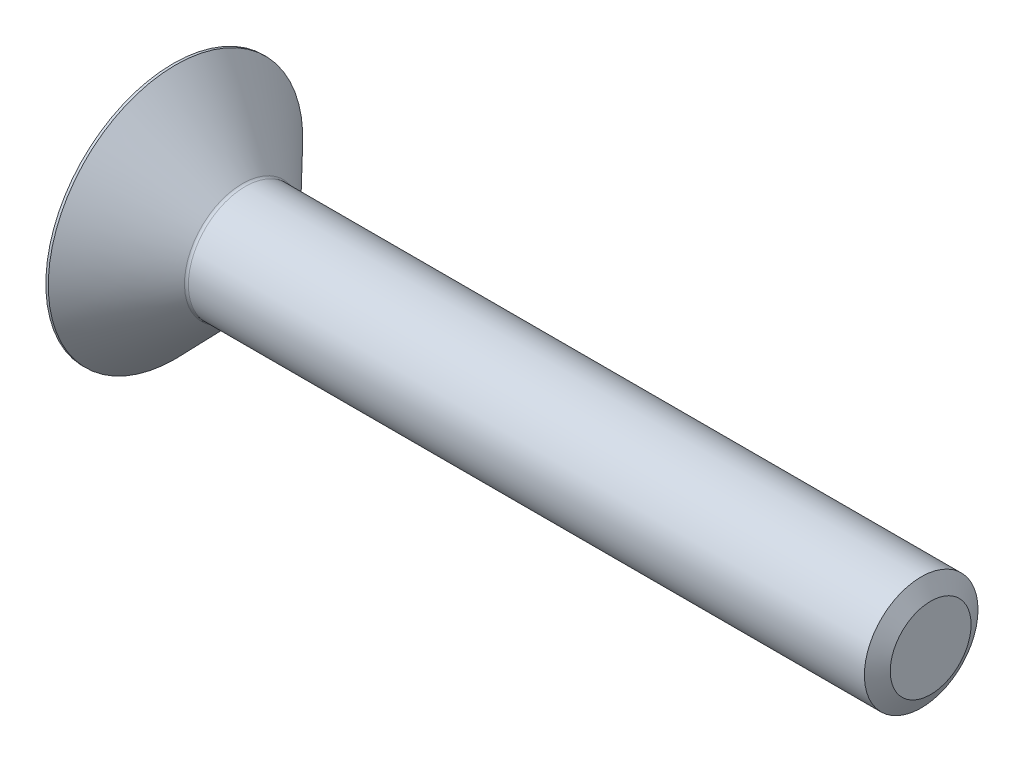
ISO-10303-21;
HEADER;
FILE_DESCRIPTION(('STEP AP214'),'2;1');
FILE_NAME('part.step','',(''),(''),'','','');
FILE_SCHEMA(('AUTOMOTIVE_DESIGN { 1 0 10303 214 1 1 1 1 }'));
ENDSEC;
DATA;
#1=APPLICATION_CONTEXT('core data for automotive mechanical design processes');
#2=APPLICATION_PROTOCOL_DEFINITION('international standard','automotive_design',2000,#1);
#3=PRODUCT_CONTEXT('',#1,'mechanical');
#4=PRODUCT('Part','Part','',(#3));
#5=PRODUCT_RELATED_PRODUCT_CATEGORY('part','',(#4));
#6=PRODUCT_DEFINITION_FORMATION('','',#4);
#7=PRODUCT_DEFINITION_CONTEXT('part definition',#1,'design');
#8=PRODUCT_DEFINITION('design','',#6,#7);
#9=PRODUCT_DEFINITION_SHAPE('','',#8);
#10=(LENGTH_UNIT() NAMED_UNIT(*) SI_UNIT(.MILLI.,.METRE.));
#11=(NAMED_UNIT(*) PLANE_ANGLE_UNIT() SI_UNIT($,.RADIAN.));
#12=(NAMED_UNIT(*) SI_UNIT($,.STERADIAN.) SOLID_ANGLE_UNIT());
#13=UNCERTAINTY_MEASURE_WITH_UNIT(LENGTH_MEASURE(1.E-05),#10,'distance_accuracy_value','');
#14=(GEOMETRIC_REPRESENTATION_CONTEXT(3) GLOBAL_UNCERTAINTY_ASSIGNED_CONTEXT((#13)) GLOBAL_UNIT_ASSIGNED_CONTEXT((#10,
#11,#12)) REPRESENTATION_CONTEXT('',''));
#15=CARTESIAN_POINT('',(0.,0.,0.));
#16=DIRECTION('',(0.,0.,1.));
#17=DIRECTION('',(1.,0.,0.));
#18=AXIS2_PLACEMENT_3D('',#15,#16,#17);
#19=CARTESIAN_POINT('',(0.,0.,0.));
#20=DIRECTION('',(1.,0.,0.));
#21=DIRECTION('',(0.,1.,0.));
#22=AXIS2_PLACEMENT_3D('',#19,#20,#21);
#23=CYLINDRICAL_SURFACE('',#22,1.5);
#24=CARTESIAN_POINT('',(-18.097552518379,0.,0.));
#25=DIRECTION('',(-1.,0.,0.));
#26=DIRECTION('',(0.,1.,0.));
#27=AXIS2_PLACEMENT_3D('',#24,#25,#26);
#28=CIRCLE('',#27,1.5);
#29=CARTESIAN_POINT('',(-18.097552518379,1.5,0.));
#30=VERTEX_POINT('',#29);
#31=EDGE_CURVE('E117',#30,#30,#28,.T.);
#32=ORIENTED_EDGE('',*,*,#31,.F.);
#33=EDGE_LOOP('',(#32));
#34=FACE_BOUND('',#33,.T.);
#35=CARTESIAN_POINT('',(-0.25,0.,0.));
#36=DIRECTION('',(1.,0.,0.));
#37=DIRECTION('',(0.,0.,-1.));
#38=AXIS2_PLACEMENT_3D('',#35,#36,#37);
#39=CIRCLE('',#38,1.5);
#40=CARTESIAN_POINT('',(-0.25,0.,-1.5));
#41=VERTEX_POINT('',#40);
#42=EDGE_CURVE('E279',#41,#41,#39,.T.);
#43=ORIENTED_EDGE('',*,*,#42,.F.);
#44=EDGE_LOOP('',(#43));
#45=FACE_BOUND('',#44,.T.);
#46=ADVANCED_FACE('F47',(#34,#45),#23,.T.);
#47=CARTESIAN_POINT('',(-20.,3.36,0.));
#48=DIRECTION('',(-1.,0.,0.));
#49=DIRECTION('',(0.,-1.,0.));
#50=AXIS2_PLACEMENT_3D('',#47,#48,#49);
#51=PLANE('',#50);
#52=CARTESIAN_POINT('',(-20.,0.,0.));
#53=DIRECTION('',(-1.,0.,0.));
#54=DIRECTION('',(0.,1.,0.));
#55=AXIS2_PLACEMENT_3D('',#52,#53,#54);
#56=CIRCLE('',#55,3.36);
#57=CARTESIAN_POINT('',(-20.,3.36,0.));
#58=VERTEX_POINT('',#57);
#59=EDGE_CURVE('E151',#58,#58,#56,.T.);
#60=ORIENTED_EDGE('',*,*,#59,.T.);
#61=EDGE_LOOP('',(#60));
#62=FACE_BOUND('',#61,.T.);
#63=CARTESIAN_POINT('',(-20.,0.,0.));
#64=DIRECTION('',(1.,0.,0.));
#65=DIRECTION('',(0.,-1.,0.));
#66=AXIS2_PLACEMENT_3D('',#63,#64,#65);
#67=CIRCLE('',#66,1.15470053837925);
#68=CARTESIAN_POINT('',(-20.,-0.577350269189632,-0.999999999999995));
#69=VERTEX_POINT('',#68);
#70=CARTESIAN_POINT('',(-20.,-1.15470053837925,0.));
#71=VERTEX_POINT('',#70);
#72=EDGE_CURVE('E51',#69,#71,#67,.F.);
#73=ORIENTED_EDGE('',*,*,#72,.F.);
#74=CARTESIAN_POINT('',(-20.,0.577350269189629,-0.999999999999997));
#75=VERTEX_POINT('',#74);
#76=EDGE_CURVE('E133',#75,#69,#67,.F.);
#77=ORIENTED_EDGE('',*,*,#76,.F.);
#78=CARTESIAN_POINT('',(-20.,0.,0.));
#79=DIRECTION('',(1.,0.,0.));
#80=DIRECTION('',(0.,0.,-1.));
#81=AXIS2_PLACEMENT_3D('',#78,#79,#80);
#82=CIRCLE('',#81,1.15470053837925);
#83=CARTESIAN_POINT('',(-20.,1.15470053837925,0.));
#84=VERTEX_POINT('',#83);
#85=EDGE_CURVE('E138',#75,#84,#82,.T.);
#86=ORIENTED_EDGE('',*,*,#85,.T.);
#87=CARTESIAN_POINT('',(-20.,0.577350269189625,0.999999999999999));
#88=VERTEX_POINT('',#87);
#89=EDGE_CURVE('E148',#88,#84,#67,.F.);
#90=ORIENTED_EDGE('',*,*,#89,.F.);
#91=CARTESIAN_POINT('',(-20.,-0.577350269189632,0.999999999999996));
#92=VERTEX_POINT('',#91);
#93=EDGE_CURVE('E56',#92,#88,#67,.F.);
#94=ORIENTED_EDGE('',*,*,#93,.F.);
#95=EDGE_CURVE('E11',#71,#92,#67,.F.);
#96=ORIENTED_EDGE('',*,*,#95,.F.);
#97=EDGE_LOOP('',(#73,#77,#86,#90,#94,#96));
#98=FACE_BOUND('',#97,.T.);
#99=ADVANCED_FACE('F145',(#62,#98),#51,.T.);
#100=CARTESIAN_POINT('',(0.,0.,0.));
#101=DIRECTION('',(1.,0.,0.));
#102=DIRECTION('',(0.,1.,0.));
#103=AXIS2_PLACEMENT_3D('',#100,#101,#102);
#104=CYLINDRICAL_SURFACE('',#103,3.36);
#105=ORIENTED_EDGE('',*,*,#59,.F.);
#106=EDGE_LOOP('',(#105));
#107=FACE_BOUND('',#106,.T.);
#108=CARTESIAN_POINT('',(-19.9361811211411,0.,0.));
#109=DIRECTION('',(-1.,0.,0.));
#110=DIRECTION('',(0.,1.,0.));
#111=AXIS2_PLACEMENT_3D('',#108,#109,#110);
#112=CIRCLE('',#111,3.36);
#113=CARTESIAN_POINT('',(-19.9361811211411,3.36,0.));
#114=VERTEX_POINT('',#113);
#115=EDGE_CURVE('E155',#114,#114,#112,.T.);
#116=ORIENTED_EDGE('',*,*,#115,.T.);
#117=EDGE_LOOP('',(#116));
#118=FACE_BOUND('',#117,.T.);
#119=ADVANCED_FACE('F260',(#107,#118),#104,.T.);
#120=CARTESIAN_POINT('',(-18.1694864984129,0.,0.));
#121=DIRECTION('',(-1.,0.,0.));
#122=DIRECTION('',(0.,-1.,0.));
#123=AXIS2_PLACEMENT_3D('',#120,#121,#122);
#124=CONICAL_SURFACE('',#123,1.5305341629541,0.802851455917392);
#125=ORIENTED_EDGE('',*,*,#115,.F.);
#126=EDGE_LOOP('',(#125));
#127=FACE_BOUND('',#126,.T.);
#128=CARTESIAN_POINT('',(-18.1694864984129,0.,0.));
#129=DIRECTION('',(-1.,0.,0.));
#130=DIRECTION('',(0.,1.,0.));
#131=AXIS2_PLACEMENT_3D('',#128,#129,#130);
#132=CIRCLE('',#131,1.5305341629541);
#133=CARTESIAN_POINT('',(-18.1694864984129,1.5305341629541,0.));
#134=VERTEX_POINT('',#133);
#135=EDGE_CURVE('E254',#134,#134,#132,.T.);
#136=ORIENTED_EDGE('',*,*,#135,.T.);
#137=EDGE_LOOP('',(#136));
#138=FACE_BOUND('',#137,.T.);
#139=ADVANCED_FACE('F262',(#127,#138),#124,.T.);
#140=CARTESIAN_POINT('',(-18.097552518379,0.,0.));
#141=DIRECTION('',(1.,0.,0.));
#142=DIRECTION('',(0.,1.,0.));
#143=AXIS2_PLACEMENT_3D('',#140,#141,#142);
#144=TOROIDAL_SURFACE('',#143,1.6,0.099999999999999);
#145=ORIENTED_EDGE('',*,*,#135,.F.);
#146=EDGE_LOOP('',(#145));
#147=FACE_BOUND('',#146,.T.);
#148=ORIENTED_EDGE('',*,*,#31,.T.);
#149=EDGE_LOOP('',(#148));
#150=FACE_BOUND('',#149,.T.);
#151=ADVANCED_FACE('F265',(#147,#150),#144,.F.);
#152=CARTESIAN_POINT('',(-19.7,0.,0.));
#153=DIRECTION('',(-1.,0.,0.));
#154=DIRECTION('',(0.,0.,-1.));
#155=AXIS2_PLACEMENT_3D('',#152,#153,#154);
#156=CONICAL_SURFACE('',#155,0.,1.31660847419538);
#157=CARTESIAN_POINT('',(-20.0000300044996,-0.57723479913579,-1.0002));
#158=CARTESIAN_POINT('',(-19.9937929192042,-0.601225021738601,-0.958647715567044));
#159=CARTESIAN_POINT('',(-19.9881313786167,-0.625256195021442,-0.917024502475671));
#160=CARTESIAN_POINT('',(-19.9781854217223,-0.673398386330441,-0.833639781140785));
#161=CARTESIAN_POINT('',(-19.9739015302713,-0.697509431260086,-0.791878226299064));
#162=CARTESIAN_POINT('',(-19.9669589031667,-0.745673772514857,-0.708455140132714));
#163=CARTESIAN_POINT('',(-19.9642923745456,-0.769726780462719,-0.66679410829216));
#164=CARTESIAN_POINT('',(-19.9607168929941,-0.817861664223351,-0.583422044002323));
#165=CARTESIAN_POINT('',(-19.9598076211353,-0.841943534003896,-0.541711022001162));
#166=CARTESIAN_POINT('',(-19.9598076211353,-0.890107273564986,-0.458288977998839));
#167=CARTESIAN_POINT('',(-19.9607168929941,-0.91418914334553,-0.416577955997678));
#168=CARTESIAN_POINT('',(-19.9642923745456,-0.962324027106162,-0.333205891707841));
#169=CARTESIAN_POINT('',(-19.9669589031667,-0.986377035054024,-0.291544859867286));
#170=CARTESIAN_POINT('',(-19.9739015302713,-1.0345413763088,-0.208121773700937));
#171=CARTESIAN_POINT('',(-19.9781854217223,-1.05865242123844,-0.166360218859216));
#172=CARTESIAN_POINT('',(-19.9881313786167,-1.10679461254744,-0.0829754975243293));
#173=CARTESIAN_POINT('',(-19.9937929192042,-1.13082578583028,-0.0413522844329566));
#174=CARTESIAN_POINT('',(-20.0000300044996,-1.15481600843309,0.000199999999999027));
#175=B_SPLINE_CURVE_WITH_KNOTS('',3,(#157,#158,#159,#160,#161,#162,#163,#164,#165,#166,#167,
#168,#169,#170,#171,#172,#173,#174),.UNSPECIFIED.,.F.,.F.,(4,2,2,2,2,2,2,2,4),(0.,
0.145159524820137,0.290374287087484,0.434883682122849,0.57936684736763,0.723850012612411,
0.868359407647776,1.01357416991512,1.15873369473526),.UNSPECIFIED.);
#176=EDGE_CURVE('E135',#69,#71,#175,.T.);
#177=ORIENTED_EDGE('',*,*,#176,.F.);
#178=ORIENTED_EDGE('',*,*,#72,.T.);
#179=EDGE_LOOP('',(#177,#178));
#180=FACE_BOUND('',#179,.T.);
#181=ADVANCED_FACE('F271',(#180),#156,.F.);
#182=CARTESIAN_POINT('',(-20.1701338061757,-1.50813004503231,-1.));
#183=CARTESIAN_POINT('',(-20.1603550434582,-1.4629616955144,-1.));
#184=CARTESIAN_POINT('',(-20.1507010634319,-1.41776633015548,-1.));
#185=CARTESIAN_POINT('',(-20.1317057249496,-1.32730802004726,-1.));
#186=CARTESIAN_POINT('',(-20.1223643798043,-1.28204507250605,-1.));
#187=CARTESIAN_POINT('',(-20.094887707109,-1.14605409321351,-1.));
#188=CARTESIAN_POINT('',(-20.077318593487,-1.05520983554784,-1.));
#189=CARTESIAN_POINT('',(-20.0446113120355,-0.873838301527075,-1.));
#190=CARTESIAN_POINT('',(-20.0294545669183,-0.783314439111175,-1.));
#191=CARTESIAN_POINT('',(-20.0026000869216,-0.601754544937862,-1.));
#192=CARTESIAN_POINT('',(-19.9909016960468,-0.510718613654574,-1.));
#193=CARTESIAN_POINT('',(-19.9724688104588,-0.327147289363391,-1.));
#194=CARTESIAN_POINT('',(-19.965787761882,-0.234606191530869,-1.));
#195=CARTESIAN_POINT('',(-19.9590368362792,-0.049304654603892,-1.));
#196=CARTESIAN_POINT('',(-19.9589640024594,0.0434556678202334,-1.));
#197=CARTESIAN_POINT('',(-19.9654534933963,0.229083736297408,-1.));
#198=CARTESIAN_POINT('',(-19.9720414736928,0.321950510989412,-1.));
#199=CARTESIAN_POINT('',(-19.9904572139866,0.507192547661323,-1.));
#200=CARTESIAN_POINT('',(-20.0022884816114,0.599567438647768,-1.));
#201=CARTESIAN_POINT('',(-20.0298118313046,0.785811374344477,-1.));
#202=CARTESIAN_POINT('',(-20.0455836030667,0.879668210998828,-1.));
#203=CARTESIAN_POINT('',(-20.0795232966728,1.06695285350417,-1.));
#204=CARTESIAN_POINT('',(-20.0976915787193,1.16038059267178,-1.));
#205=CARTESIAN_POINT('',(-20.1355853163011,1.34694314919726,-1.));
#206=CARTESIAN_POINT('',(-20.1553112029702,1.44007787798179,-1.));
#207=CARTESIAN_POINT('',(-20.1957971322914,1.62612272763755,-1.));
#208=CARTESIAN_POINT('',(-20.216557196056,1.71903284388273,-1.));
#209=CARTESIAN_POINT('',(-20.2585485742601,1.90363742744432,-1.));
#210=CARTESIAN_POINT('',(-20.2797718689088,1.99533372655925,-1.));
#211=CARTESIAN_POINT('',(-20.3227143057913,2.17861191601367,-1.));
#212=CARTESIAN_POINT('',(-20.3444334585808,2.27019380387373,-1.));
#213=CARTESIAN_POINT('',(-20.3882042420233,2.45314970796374,-1.));
#214=CARTESIAN_POINT('',(-20.4102553943374,2.54452383886909,-1.));
#215=CARTESIAN_POINT('',(-20.4546332471854,2.72720190599484,-1.));
#216=CARTESIAN_POINT('',(-20.4769599382911,2.81850584450411,-1.));
#217=CARTESIAN_POINT('',(-20.4993826695211,2.90978592143881,-1.));
#218=B_SPLINE_CURVE_WITH_KNOTS('',3,(#182,#183,#184,#185,#186,#187,#188,#189,#190,#191,#192,
#193,#194,#195,#196,#197,#198,#199,#200,#201,#202,#203,#204,#205,#206,#207,#208,#209,#210,#211,
#212,#213,#214,#215,#216,#217),.UNSPECIFIED.,.F.,.F.,(4,2,2,2,2,2,2,2,2,2,2,2,2,2,2,2,2,4),(0.,
0.138643869889784,0.277293635233155,0.554857004517547,0.830167022781712,1.10542478551795,
1.38357462934899,1.66160001660697,1.94070037269333,2.21998772241581,2.50545939030147,
2.79097401441241,3.07656794584653,3.36216771000263,3.64452690710854,3.92689212062336,
4.2088834354874,4.49086512790399),.UNSPECIFIED.);
#219=EDGE_CURVE('E110',#75,#69,#218,.F.);
#220=ORIENTED_EDGE('',*,*,#219,.F.);
#221=ORIENTED_EDGE('',*,*,#76,.T.);
#222=EDGE_LOOP('',(#220,#221));
#223=FACE_BOUND('',#222,.T.);
#224=ADVANCED_FACE('F131',(#223),#156,.F.);
#225=CARTESIAN_POINT('',(-20.0000300044996,1.15481600843309,0.000199999999999895));
#226=CARTESIAN_POINT('',(-19.9937929192042,1.13082578583028,-0.0413522844329562));
#227=CARTESIAN_POINT('',(-19.9881313786167,1.10679461254744,-0.082975497524329));
#228=CARTESIAN_POINT('',(-19.9781854217223,1.05865242123844,-0.166360218859216));
#229=CARTESIAN_POINT('',(-19.9739015302713,1.03454137630879,-0.208121773700936));
#230=CARTESIAN_POINT('',(-19.9669589031667,0.986377035054022,-0.291544859867286));
#231=CARTESIAN_POINT('',(-19.9642923745456,0.96232402710616,-0.33320589170784));
#232=CARTESIAN_POINT('',(-19.9607168929941,0.914189143345528,-0.416577955997677));
#233=CARTESIAN_POINT('',(-19.9598076211353,0.890107273564983,-0.458288977998838));
#234=CARTESIAN_POINT('',(-19.9598076211353,0.841943534003893,-0.541711022001161));
#235=CARTESIAN_POINT('',(-19.9607168929941,0.817861664223348,-0.583422044002323));
#236=CARTESIAN_POINT('',(-19.9642923745456,0.769726780462716,-0.666794108292159));
#237=CARTESIAN_POINT('',(-19.9669589031667,0.745673772514854,-0.708455140132714));
#238=CARTESIAN_POINT('',(-19.9739015302713,0.697509431260083,-0.791878226299064));
#239=CARTESIAN_POINT('',(-19.9781854217223,0.673398386330438,-0.833639781140784));
#240=CARTESIAN_POINT('',(-19.9881313786167,0.62525619502144,-0.917024502475671));
#241=CARTESIAN_POINT('',(-19.9937929192042,0.601225021738599,-0.958647715567044));
#242=CARTESIAN_POINT('',(-20.0000300044996,0.577234799135788,-1.0002));
#243=B_SPLINE_CURVE_WITH_KNOTS('',3,(#225,#226,#227,#228,#229,#230,#231,#232,#233,#234,#235,
#236,#237,#238,#239,#240,#241,#242),.UNSPECIFIED.,.F.,.F.,(4,2,2,2,2,2,2,2,4),(0.,
0.145159524820138,0.290374287087485,0.43488368212285,0.579366847367631,0.723850012612412,
0.868359407647777,1.01357416991512,1.15873369473526),.UNSPECIFIED.);
#244=EDGE_CURVE('E121',#84,#75,#243,.T.);
#245=ORIENTED_EDGE('',*,*,#244,.F.);
#246=ORIENTED_EDGE('',*,*,#85,.F.);
#247=EDGE_LOOP('',(#245,#246));
#248=FACE_BOUND('',#247,.T.);
#249=ADVANCED_FACE('F139',(#248),#156,.F.);
#250=CARTESIAN_POINT('',(-20.0000300044996,0.577234799135787,1.0002));
#251=CARTESIAN_POINT('',(-19.9937929192042,0.601225021738598,0.958647715567043));
#252=CARTESIAN_POINT('',(-19.9881313786167,0.62525619502144,0.91702450247567));
#253=CARTESIAN_POINT('',(-19.9781854217223,0.673398386330438,0.833639781140784));
#254=CARTESIAN_POINT('',(-19.9739015302713,0.697509431260083,0.791878226299063));
#255=CARTESIAN_POINT('',(-19.9669589031667,0.745673772514854,0.708455140132714));
#256=CARTESIAN_POINT('',(-19.9642923745456,0.769726780462716,0.666794108292159));
#257=CARTESIAN_POINT('',(-19.9607168929941,0.817861664223348,0.583422044002322));
#258=CARTESIAN_POINT('',(-19.9598076211353,0.841943534003893,0.541711022001161));
#259=CARTESIAN_POINT('',(-19.9598076211353,0.890107273564983,0.458288977998838));
#260=CARTESIAN_POINT('',(-19.9607168929941,0.914189143345528,0.416577955997677));
#261=CARTESIAN_POINT('',(-19.9642923745456,0.96232402710616,0.33320589170784));
#262=CARTESIAN_POINT('',(-19.9669589031667,0.986377035054022,0.291544859867286));
#263=CARTESIAN_POINT('',(-19.9739015302713,1.03454137630879,0.208121773700936));
#264=CARTESIAN_POINT('',(-19.9781854217223,1.05865242123844,0.166360218859216));
#265=CARTESIAN_POINT('',(-19.9881313786167,1.10679461254744,0.082975497524329));
#266=CARTESIAN_POINT('',(-19.9937929192042,1.13082578583028,0.0413522844329564));
#267=CARTESIAN_POINT('',(-20.0000300044996,1.15481600843309,-0.00019999999999971));
#268=B_SPLINE_CURVE_WITH_KNOTS('',3,(#250,#251,#252,#253,#254,#255,#256,#257,#258,#259,#260,
#261,#262,#263,#264,#265,#266,#267),.UNSPECIFIED.,.F.,.F.,(4,2,2,2,2,2,2,2,4),(0.,
0.145159524820138,0.290374287087485,0.434883682122849,0.57936684736763,0.723850012612412,
0.868359407647776,1.01357416991512,1.15873369473526),.UNSPECIFIED.);
#269=EDGE_CURVE('E142',#88,#84,#268,.T.);
#270=ORIENTED_EDGE('',*,*,#269,.F.);
#271=ORIENTED_EDGE('',*,*,#89,.T.);
#272=EDGE_LOOP('',(#270,#271));
#273=FACE_BOUND('',#272,.T.);
#274=ADVANCED_FACE('F195',(#273),#156,.F.);
#275=CARTESIAN_POINT('',(-20.1701338061757,-1.50813004503231,0.999999999999999));
#276=CARTESIAN_POINT('',(-20.1603550434582,-1.4629616955144,0.999999999999999));
#277=CARTESIAN_POINT('',(-20.1507010634319,-1.41776633015548,0.999999999999999));
#278=CARTESIAN_POINT('',(-20.1317057249496,-1.32730802004726,0.999999999999999));
#279=CARTESIAN_POINT('',(-20.1223643798043,-1.28204507250605,0.999999999999999));
#280=CARTESIAN_POINT('',(-20.094887707109,-1.14605409321351,0.999999999999999));
#281=CARTESIAN_POINT('',(-20.077318593487,-1.05520983554784,0.999999999999999));
#282=CARTESIAN_POINT('',(-20.0446113120355,-0.873838301527075,0.999999999999999));
#283=CARTESIAN_POINT('',(-20.0294545669183,-0.783314439111175,0.999999999999999));
#284=CARTESIAN_POINT('',(-20.0026000869216,-0.601754544937862,0.999999999999999));
#285=CARTESIAN_POINT('',(-19.9909016960468,-0.510718613654574,0.999999999999999));
#286=CARTESIAN_POINT('',(-19.9724688104588,-0.327147289363391,0.999999999999999));
#287=CARTESIAN_POINT('',(-19.965787761882,-0.234606191530869,0.999999999999999));
#288=CARTESIAN_POINT('',(-19.9590368362792,-0.0493046546038928,0.999999999999999));
#289=CARTESIAN_POINT('',(-19.9589640024594,0.0434556678202325,0.999999999999999));
#290=CARTESIAN_POINT('',(-19.9654534933963,0.229083736297407,0.999999999999999));
#291=CARTESIAN_POINT('',(-19.9720414736928,0.321950510989411,0.999999999999999));
#292=CARTESIAN_POINT('',(-19.9904572139866,0.507192547661322,0.999999999999999));
#293=CARTESIAN_POINT('',(-20.0022884816114,0.599567438647767,0.999999999999999));
#294=CARTESIAN_POINT('',(-20.0298118313046,0.785811374344477,0.999999999999999));
#295=CARTESIAN_POINT('',(-20.0455836030667,0.879668210998828,0.999999999999999));
#296=CARTESIAN_POINT('',(-20.0795232966728,1.06695285350417,0.999999999999999));
#297=CARTESIAN_POINT('',(-20.0976915787193,1.16038059267178,0.999999999999999));
#298=CARTESIAN_POINT('',(-20.1355853163011,1.34694314919726,0.999999999999999));
#299=CARTESIAN_POINT('',(-20.1553112029702,1.44007787798179,0.999999999999999));
#300=CARTESIAN_POINT('',(-20.1957971322914,1.62612272763755,0.999999999999999));
#301=CARTESIAN_POINT('',(-20.216557196056,1.71903284388274,0.999999999999999));
#302=CARTESIAN_POINT('',(-20.2585485742601,1.90363742744432,0.999999999999999));
#303=CARTESIAN_POINT('',(-20.2797718689088,1.99533372655926,0.999999999999999));
#304=CARTESIAN_POINT('',(-20.3227143057913,2.17861191601367,0.999999999999999));
#305=CARTESIAN_POINT('',(-20.3444334585808,2.27019380387373,0.999999999999999));
#306=CARTESIAN_POINT('',(-20.3882042420233,2.45314970796374,0.999999999999999));
#307=CARTESIAN_POINT('',(-20.4102553943374,2.54452383886909,0.999999999999999));
#308=CARTESIAN_POINT('',(-20.4546332471854,2.72720190599484,0.999999999999999));
#309=CARTESIAN_POINT('',(-20.4769599382911,2.81850584450411,0.999999999999999));
#310=CARTESIAN_POINT('',(-20.4993826695211,2.90978592143881,0.999999999999999));
#311=B_SPLINE_CURVE_WITH_KNOTS('',3,(#275,#276,#277,#278,#279,#280,#281,#282,#283,#284,#285,
#286,#287,#288,#289,#290,#291,#292,#293,#294,#295,#296,#297,#298,#299,#300,#301,#302,#303,#304,
#305,#306,#307,#308,#309,#310),.UNSPECIFIED.,.F.,.F.,(4,2,2,2,2,2,2,2,2,2,2,2,2,2,2,2,2,4),(0.,
0.138643869889784,0.277293635233155,0.554857004517547,0.830167022781712,1.10542478551795,
1.38357462934899,1.66160001660697,1.94070037269333,2.21998772241581,2.50545939030147,
2.79097401441241,3.07656794584654,3.36216771000263,3.64452690710854,3.92689212062336,
4.2088834354874,4.49086512790399),.UNSPECIFIED.);
#312=EDGE_CURVE('E185',#92,#88,#311,.T.);
#313=ORIENTED_EDGE('',*,*,#312,.F.);
#314=ORIENTED_EDGE('',*,*,#93,.T.);
#315=EDGE_LOOP('',(#313,#314));
#316=FACE_BOUND('',#315,.T.);
#317=ADVANCED_FACE('F344',(#316),#156,.F.);
#318=CARTESIAN_POINT('',(-20.0000300044996,-1.15481600843309,-0.000200000000000662));
#319=CARTESIAN_POINT('',(-19.9937929192042,-1.13082578583028,0.0413522844329551));
#320=CARTESIAN_POINT('',(-19.9881313786167,-1.10679461254744,0.0829754975243278));
#321=CARTESIAN_POINT('',(-19.9781854217223,-1.05865242123844,0.166360218859215));
#322=CARTESIAN_POINT('',(-19.9739015302713,-1.0345413763088,0.208121773700935));
#323=CARTESIAN_POINT('',(-19.9669589031667,-0.986377035054024,0.291544859867285));
#324=CARTESIAN_POINT('',(-19.9642923745456,-0.962324027106163,0.33320589170784));
#325=CARTESIAN_POINT('',(-19.9607168929941,-0.914189143345531,0.416577955997676));
#326=CARTESIAN_POINT('',(-19.9598076211353,-0.890107273564986,0.458288977998838));
#327=CARTESIAN_POINT('',(-19.9598076211353,-0.841943534003896,0.541711022001161));
#328=CARTESIAN_POINT('',(-19.9607168929941,-0.817861664223351,0.583422044002322));
#329=CARTESIAN_POINT('',(-19.9642923745456,-0.769726780462719,0.666794108292158));
#330=CARTESIAN_POINT('',(-19.9669589031667,-0.745673772514857,0.708455140132713));
#331=CARTESIAN_POINT('',(-19.9739015302713,-0.697509431260086,0.791878226299063));
#332=CARTESIAN_POINT('',(-19.9781854217223,-0.673398386330441,0.833639781140784));
#333=CARTESIAN_POINT('',(-19.9881313786167,-0.625256195021443,0.917024502475671));
#334=CARTESIAN_POINT('',(-19.9937929192042,-0.601225021738601,0.958647715567043));
#335=CARTESIAN_POINT('',(-20.0000300044996,-0.577234799135791,1.0002));
#336=B_SPLINE_CURVE_WITH_KNOTS('',3,(#318,#319,#320,#321,#322,#323,#324,#325,#326,#327,#328,
#329,#330,#331,#332,#333,#334,#335),.UNSPECIFIED.,.F.,.F.,(4,2,2,2,2,2,2,2,4),(0.,
0.145159524820137,0.290374287087485,0.434883682122849,0.57936684736763,0.723850012612412,
0.868359407647776,1.01357416991512,1.15873369473526),.UNSPECIFIED.);
#337=EDGE_CURVE('E202',#71,#92,#336,.T.);
#338=ORIENTED_EDGE('',*,*,#337,.F.);
#339=ORIENTED_EDGE('',*,*,#95,.T.);
#340=EDGE_LOOP('',(#338,#339));
#341=FACE_BOUND('',#340,.T.);
#342=ADVANCED_FACE('F336',(#341),#156,.F.);
#343=CARTESIAN_POINT('',(-18.9,0.,0.));
#344=DIRECTION('',(-1.,0.,0.));
#345=DIRECTION('',(0.,0.,-1.));
#346=AXIS2_PLACEMENT_3D('',#343,#344,#345);
#347=CONICAL_SURFACE('',#346,1.15470053837925,1.0471975511966);
#348=CARTESIAN_POINT('',(-18.2333333333333,0.,0.));
#349=VERTEX_POINT('',#348);
#350=VERTEX_LOOP('',#349);
#351=FACE_BOUND('',#350,.T.);
#352=CARTESIAN_POINT('',(-19.2718352887395,-1.49514512143374,-1.));
#353=CARTESIAN_POINT('',(-19.2511150207934,-1.4519612611533,-1.));
#354=CARTESIAN_POINT('',(-19.2306136723495,-1.40867282404236,-1.));
#355=CARTESIAN_POINT('',(-19.1901634335246,-1.32182947914248,-1.));
#356=CARTESIAN_POINT('',(-19.1702146425673,-1.27827452509756,-1.));
#357=CARTESIAN_POINT('',(-19.1111451548365,-1.14662339890625,-1.));
#358=CARTESIAN_POINT('',(-19.073052526533,-1.05805724149108,-1.));
#359=CARTESIAN_POINT('',(-19.0002458207006,-0.876833003172497,-1.));
#360=CARTESIAN_POINT('',(-18.9656458404539,-0.784128452056496,-1.));
#361=CARTESIAN_POINT('',(-18.9040734738184,-0.596331746532132,-1.));
#362=CARTESIAN_POINT('',(-18.8770812848479,-0.501246505541258,-1.));
#363=CARTESIAN_POINT('',(-18.845775770035,-0.356699986452704,-1.));
#364=CARTESIAN_POINT('',(-18.836875098547,-0.30824416317171,-1.));
#365=CARTESIAN_POINT('',(-18.8227424317569,-0.210788870695443,-1.));
#366=CARTESIAN_POINT('',(-18.8175101885352,-0.161789438465743,-1.));
#367=CARTESIAN_POINT('',(-18.8111989809818,-0.0641060489970667,-1.));
#368=CARTESIAN_POINT('',(-18.8100710050111,-0.0154253461269775,-1.));
#369=CARTESIAN_POINT('',(-18.8119329783051,0.0818553564032749,-1.));
#370=CARTESIAN_POINT('',(-18.8149231825536,0.130455350879702,-1.));
#371=CARTESIAN_POINT('',(-18.8271183217293,0.250369589613778,-1.));
#372=CARTESIAN_POINT('',(-18.8386085609849,0.321451919115026,-1.));
#373=CARTESIAN_POINT('',(-18.8682403173976,0.462229038490167,-1.));
#374=CARTESIAN_POINT('',(-18.8863898509449,0.531922048861732,-1.));
#375=CARTESIAN_POINT('',(-18.9278697226866,0.671415729806804,-1.));
#376=CARTESIAN_POINT('',(-18.9513071683069,0.741183729418068,-1.));
#377=CARTESIAN_POINT('',(-19.0015644882464,0.879438319396286,-1.));
#378=CARTESIAN_POINT('',(-19.0283831752305,0.947925349932559,-1.));
#379=CARTESIAN_POINT('',(-19.1000539154734,1.12214515906644,-1.));
#380=CARTESIAN_POINT('',(-19.146572305199,1.22718574040677,-1.));
#381=CARTESIAN_POINT('',(-19.242876922248,1.43575968104557,-1.));
#382=CARTESIAN_POINT('',(-19.2926639878222,1.53929264533347,-1.));
#383=CARTESIAN_POINT('',(-19.3943364445346,1.74546702338821,-1.));
#384=CARTESIAN_POINT('',(-19.446224181867,1.84810727553998,-1.));
#385=CARTESIAN_POINT('',(-19.5513383688352,2.05270058021726,-1.));
#386=CARTESIAN_POINT('',(-19.6045648626723,2.15465360991172,-1.));
#387=CARTESIAN_POINT('',(-19.7068669169112,2.34846553091283,-1.));
#388=CARTESIAN_POINT('',(-19.755859658964,2.4403682316157,-1.));
#389=CARTESIAN_POINT('',(-19.8544031328282,2.623877990053,-1.));
#390=CARTESIAN_POINT('',(-19.9039538852895,2.71548503668386,-1.));
#391=CARTESIAN_POINT('',(-20.0033471076798,2.89823865557593,-1.));
#392=CARTESIAN_POINT('',(-20.053188515041,2.98938580641155,-1.));
#393=CARTESIAN_POINT('',(-20.1531957233761,3.17149583112621,-1.));
#394=CARTESIAN_POINT('',(-20.2033615072371,3.26245871439935,-1.));
#395=CARTESIAN_POINT('',(-20.253646212205,3.35335539208175,-1.));
#396=B_SPLINE_CURVE_WITH_KNOTS('',3,(#352,#353,#354,#355,#356,#357,#358,#359,#360,#361,#362,
#363,#364,#365,#366,#367,#368,#369,#370,#371,#372,#373,#374,#375,#376,#377,#378,#379,#380,#381,
#382,#383,#384,#385,#386,#387,#388,#389,#390,#391,#392,#393,#394,#395),.UNSPECIFIED.,.F.,.F.,(4,
2,2,2,2,2,2,2,2,2,2,2,2,2,2,2,2,2,2,2,2,4),(0.,0.14369034182065,0.287406372566273,
0.576560332877491,0.87325948893403,1.16917907000006,1.31686338831957,1.46453772487642,
1.61044269221659,1.75635669390452,1.97192533331898,2.18775432802313,2.40842600301165,
2.62902040304935,2.97355048126458,3.31816926186283,3.6631841739513,4.00821049225241,
4.32064609598596,4.63309330006987,4.9447457824876,5.2563819552864),.UNSPECIFIED.);
#397=CARTESIAN_POINT('',(-18.9,-0.577350269189628,-1.));
#398=VERTEX_POINT('',#397);
#399=CARTESIAN_POINT('',(-18.9,0.577350269189626,-1.));
#400=VERTEX_POINT('',#399);
#401=EDGE_CURVE('E113',#398,#400,#396,.T.);
#402=ORIENTED_EDGE('',*,*,#401,.F.);
#403=CARTESIAN_POINT('',(-18.9000666766657,-1.15481600843309,0.000199999999999338));
#404=CARTESIAN_POINT('',(-18.8854089736491,-1.12944301174833,-0.0437473193982806));
#405=CARTESIAN_POINT('',(-18.8720777236209,-1.10385100003722,-0.0880739839498211));
#406=CARTESIAN_POINT('',(-18.8488065076235,-1.05222370923805,-0.177495074671123));
#407=CARTESIAN_POINT('',(-18.8388747765498,-1.02618751195472,-0.222591091201732));
#408=CARTESIAN_POINT('',(-18.8234126948821,-0.974437829480511,-0.31222417052262));
#409=CARTESIAN_POINT('',(-18.817779468099,-0.948732312346696,-0.35674743223322));
#410=CARTESIAN_POINT('',(-18.8110512886403,-0.897200159195208,-0.446003739715018));
#411=CARTESIAN_POINT('',(-18.8099507679217,-0.871373710819098,-0.490736460481496));
#412=CARTESIAN_POINT('',(-18.8122250522981,-0.823104543442189,-0.574341110817348));
#413=CARTESIAN_POINT('',(-18.8150414388634,-0.800654644281322,-0.613225476788767));
#414=CARTESIAN_POINT('',(-18.8239724502174,-0.755901125586786,-0.690740844985187));
#415=CARTESIAN_POINT('',(-18.8300901337543,-0.733597661157428,-0.72937157856164));
#416=CARTESIAN_POINT('',(-18.8453857257258,-0.688751668428421,-0.807047116484146));
#417=CARTESIAN_POINT('',(-18.854628552169,-0.666214823887577,-0.846082076271168));
#418=CARTESIAN_POINT('',(-18.8756068457555,-0.621477507484252,-0.923569381276013));
#419=CARTESIAN_POINT('',(-18.8873373751337,-0.599276461273707,-0.96202272129386));
#420=CARTESIAN_POINT('',(-18.9000666766657,-0.57723479913579,-1.0002));
#421=B_SPLINE_CURVE_WITH_KNOTS('',3,(#403,#404,#405,#406,#407,#408,#409,#410,#411,#412,#413,
#414,#415,#416,#417,#418,#419,#420),.UNSPECIFIED.,.F.,.F.,(4,2,2,2,2,2,2,2,4),(0.,
0.158523820030116,0.317428970089343,0.472400167924634,0.627180939971649,0.762016584872711,
0.896977373984233,1.03493410168667,1.17261952416172),.UNSPECIFIED.);
#422=CARTESIAN_POINT('',(-18.9,-1.15470053837925,0.));
#423=VERTEX_POINT('',#422);
#424=EDGE_CURVE('E235',#423,#398,#421,.T.);
#425=ORIENTED_EDGE('',*,*,#424,.F.);
#426=CARTESIAN_POINT('',(-18.9000666766657,-0.57723479913579,1.0002));
#427=CARTESIAN_POINT('',(-18.8854089736491,-0.60260779582055,0.956252680601719));
#428=CARTESIAN_POINT('',(-18.8720777236209,-0.62819980753166,0.911926016050179));
#429=CARTESIAN_POINT('',(-18.8488065076235,-0.679827098330833,0.822504925328877));
#430=CARTESIAN_POINT('',(-18.8388747765498,-0.705863295614161,0.777408908798267));
#431=CARTESIAN_POINT('',(-18.8234126948821,-0.75761297808837,0.68777582947738));
#432=CARTESIAN_POINT('',(-18.817779468099,-0.783318495222185,0.643252567766779));
#433=CARTESIAN_POINT('',(-18.8110512886403,-0.834850648373673,0.553996260284981));
#434=CARTESIAN_POINT('',(-18.8099507679217,-0.860677096749783,0.509263539518504));
#435=CARTESIAN_POINT('',(-18.8122250522981,-0.908946264126692,0.425658889182652));
#436=CARTESIAN_POINT('',(-18.8150414388634,-0.931396163287559,0.386774523211232));
#437=CARTESIAN_POINT('',(-18.8239724502174,-0.976149681982095,0.309259155014812));
#438=CARTESIAN_POINT('',(-18.8300901337543,-0.998453146411453,0.270628421438359));
#439=CARTESIAN_POINT('',(-18.8453857257258,-1.04329913914046,0.192952883515853));
#440=CARTESIAN_POINT('',(-18.854628552169,-1.0658359836813,0.15391792372883));
#441=CARTESIAN_POINT('',(-18.8756068457555,-1.11057330008463,0.0764306187239859));
#442=CARTESIAN_POINT('',(-18.8873373751337,-1.13277434629517,0.0379772787061392));
#443=CARTESIAN_POINT('',(-18.9000666766657,-1.15481600843309,-0.00020000000000061));
#444=B_SPLINE_CURVE_WITH_KNOTS('',3,(#426,#427,#428,#429,#430,#431,#432,#433,#434,#435,#436,
#437,#438,#439,#440,#441,#442,#443),.UNSPECIFIED.,.F.,.F.,(4,2,2,2,2,2,2,2,4),(0.,
0.158523820030115,0.317428970089343,0.472400167924634,0.627180939971649,0.762016584872711,
0.896977373984233,1.03493410168667,1.17261952416172),.UNSPECIFIED.);
#445=CARTESIAN_POINT('',(-18.9,-0.577350269189628,0.999999999999999));
#446=VERTEX_POINT('',#445);
#447=EDGE_CURVE('E456',#446,#423,#444,.T.);
#448=ORIENTED_EDGE('',*,*,#447,.F.);
#449=CARTESIAN_POINT('',(-19.2718352887395,-1.49514512143374,0.999999999999999));
#450=CARTESIAN_POINT('',(-19.2511150207934,-1.4519612611533,0.999999999999999));
#451=CARTESIAN_POINT('',(-19.2306136723495,-1.40867282404236,0.999999999999999));
#452=CARTESIAN_POINT('',(-19.1901634335246,-1.32182947914248,0.999999999999999));
#453=CARTESIAN_POINT('',(-19.1702146425673,-1.27827452509756,0.999999999999999));
#454=CARTESIAN_POINT('',(-19.1111451548365,-1.14662339890625,0.999999999999999));
#455=CARTESIAN_POINT('',(-19.073052526533,-1.05805724149109,0.999999999999999));
#456=CARTESIAN_POINT('',(-19.0002458207006,-0.876833003172498,0.999999999999999));
#457=CARTESIAN_POINT('',(-18.9656458404539,-0.784128452056497,0.999999999999999));
#458=CARTESIAN_POINT('',(-18.9040734738184,-0.596331746532132,0.999999999999999));
#459=CARTESIAN_POINT('',(-18.8770812848479,-0.501246505541259,0.999999999999999));
#460=CARTESIAN_POINT('',(-18.845775770035,-0.356699986452705,0.999999999999999));
#461=CARTESIAN_POINT('',(-18.836875098547,-0.308244163171712,0.999999999999999));
#462=CARTESIAN_POINT('',(-18.8227424317569,-0.210788870695445,0.999999999999999));
#463=CARTESIAN_POINT('',(-18.8175101885352,-0.161789438465744,0.999999999999999));
#464=CARTESIAN_POINT('',(-18.8111989809818,-0.0641060489970678,0.999999999999999));
#465=CARTESIAN_POINT('',(-18.8100710050111,-0.0154253461269785,0.999999999999999));
#466=CARTESIAN_POINT('',(-18.8119329783051,0.081855356403274,0.999999999999999));
#467=CARTESIAN_POINT('',(-18.8149231825536,0.130455350879701,0.999999999999999));
#468=CARTESIAN_POINT('',(-18.8271183217293,0.250369589613776,0.999999999999999));
#469=CARTESIAN_POINT('',(-18.8386085609849,0.321451919115026,0.999999999999999));
#470=CARTESIAN_POINT('',(-18.8682403173976,0.462229038490166,0.999999999999999));
#471=CARTESIAN_POINT('',(-18.8863898509449,0.53192204886173,0.999999999999999));
#472=CARTESIAN_POINT('',(-18.9278697226866,0.671415729806802,0.999999999999999));
#473=CARTESIAN_POINT('',(-18.9513071683069,0.741183729418067,0.999999999999999));
#474=CARTESIAN_POINT('',(-19.0015644882464,0.879438319396285,0.999999999999999));
#475=CARTESIAN_POINT('',(-19.0283831752305,0.947925349932557,0.999999999999999));
#476=CARTESIAN_POINT('',(-19.1000539154734,1.12214515906644,0.999999999999999));
#477=CARTESIAN_POINT('',(-19.146572305199,1.22718574040677,0.999999999999999));
#478=CARTESIAN_POINT('',(-19.242876922248,1.43575968104557,0.999999999999999));
#479=CARTESIAN_POINT('',(-19.2926639878222,1.53929264533347,0.999999999999999));
#480=CARTESIAN_POINT('',(-19.3943364445346,1.74546702338821,0.999999999999999));
#481=CARTESIAN_POINT('',(-19.446224181867,1.84810727553998,0.999999999999999));
#482=CARTESIAN_POINT('',(-19.5513383688352,2.05270058021726,0.999999999999999));
#483=CARTESIAN_POINT('',(-19.6045648626723,2.15465360991172,0.999999999999999));
#484=CARTESIAN_POINT('',(-19.7068669169112,2.34846553091283,0.999999999999999));
#485=CARTESIAN_POINT('',(-19.755859658964,2.4403682316157,0.999999999999999));
#486=CARTESIAN_POINT('',(-19.8544031328282,2.623877990053,0.999999999999999));
#487=CARTESIAN_POINT('',(-19.9039538852895,2.71548503668386,0.999999999999999));
#488=CARTESIAN_POINT('',(-20.0033471076798,2.89823865557593,0.999999999999999));
#489=CARTESIAN_POINT('',(-20.053188515041,2.98938580641155,0.999999999999999));
#490=CARTESIAN_POINT('',(-20.1531957233761,3.17149583112621,0.999999999999999));
#491=CARTESIAN_POINT('',(-20.2033615072371,3.26245871439934,0.999999999999999));
#492=CARTESIAN_POINT('',(-20.253646212205,3.35335539208175,0.999999999999999));
#493=B_SPLINE_CURVE_WITH_KNOTS('',3,(#449,#450,#451,#452,#453,#454,#455,#456,#457,#458,#459,
#460,#461,#462,#463,#464,#465,#466,#467,#468,#469,#470,#471,#472,#473,#474,#475,#476,#477,#478,
#479,#480,#481,#482,#483,#484,#485,#486,#487,#488,#489,#490,#491,#492),.UNSPECIFIED.,.F.,.F.,(4,
2,2,2,2,2,2,2,2,2,2,2,2,2,2,2,2,2,2,2,2,4),(0.,0.14369034182065,0.287406372566273,
0.576560332877491,0.873259488934031,1.16917907000006,1.31686338831957,1.46453772487642,
1.61044269221659,1.75635669390452,1.97192533331898,2.18775432802313,2.40842600301165,
2.62902040304935,2.97355048126458,3.31816926186283,3.6631841739513,4.00821049225242,
4.32064609598596,4.63309330006987,4.9447457824876,5.2563819552864),.UNSPECIFIED.);
#494=CARTESIAN_POINT('',(-18.9,0.577350269189626,0.999999999999999));
#495=VERTEX_POINT('',#494);
#496=EDGE_CURVE('E127',#495,#446,#493,.F.);
#497=ORIENTED_EDGE('',*,*,#496,.F.);
#498=CARTESIAN_POINT('',(-18.9000666766657,1.15481600843309,-0.000200000000000381));
#499=CARTESIAN_POINT('',(-18.8854089736491,1.12944301174833,0.0437473193982798));
#500=CARTESIAN_POINT('',(-18.8720777236209,1.10385100003722,0.0880739839498201));
#501=CARTESIAN_POINT('',(-18.8488065076235,1.05222370923805,0.177495074671122));
#502=CARTESIAN_POINT('',(-18.8388747765498,1.02618751195472,0.222591091201731));
#503=CARTESIAN_POINT('',(-18.8234126948821,0.974437829480509,0.312224170522618));
#504=CARTESIAN_POINT('',(-18.817779468099,0.948732312346694,0.356747432233219));
#505=CARTESIAN_POINT('',(-18.8110512886403,0.897200159195206,0.446003739715017));
#506=CARTESIAN_POINT('',(-18.8099507679217,0.871373710819096,0.490736460481495));
#507=CARTESIAN_POINT('',(-18.8122250522981,0.823104543442187,0.574341110817346));
#508=CARTESIAN_POINT('',(-18.8150414388634,0.80065464428132,0.613225476788766));
#509=CARTESIAN_POINT('',(-18.8239724502174,0.755901125586784,0.690740844985186));
#510=CARTESIAN_POINT('',(-18.8300901337543,0.733597661157426,0.729371578561639));
#511=CARTESIAN_POINT('',(-18.8453857257258,0.688751668428419,0.807047116484144));
#512=CARTESIAN_POINT('',(-18.854628552169,0.666214823887575,0.846082076271167));
#513=CARTESIAN_POINT('',(-18.8756068457555,0.62147750748425,0.923569381276011));
#514=CARTESIAN_POINT('',(-18.8873373751337,0.599276461273705,0.962022721293858));
#515=CARTESIAN_POINT('',(-18.9000666766657,0.577234799135787,1.0002));
#516=B_SPLINE_CURVE_WITH_KNOTS('',3,(#498,#499,#500,#501,#502,#503,#504,#505,#506,#507,#508,
#509,#510,#511,#512,#513,#514,#515),.UNSPECIFIED.,.F.,.F.,(4,2,2,2,2,2,2,2,4),(0.,
0.158523820030115,0.317428970089343,0.472400167924634,0.627180939971649,0.762016584872711,
0.896977373984233,1.03493410168667,1.17261952416172),.UNSPECIFIED.);
#517=CARTESIAN_POINT('',(-18.9,1.15470053837925,0.));
#518=VERTEX_POINT('',#517);
#519=EDGE_CURVE('E149',#518,#495,#516,.T.);
#520=ORIENTED_EDGE('',*,*,#519,.F.);
#521=CARTESIAN_POINT('',(-18.9000666766657,0.577234799135788,-1.0002));
#522=CARTESIAN_POINT('',(-18.8854089736491,0.602607795820547,-0.95625268060172));
#523=CARTESIAN_POINT('',(-18.8720777236209,0.628199807531657,-0.911926016050179));
#524=CARTESIAN_POINT('',(-18.8488065076235,0.679827098330831,-0.822504925328878));
#525=CARTESIAN_POINT('',(-18.8388747765498,0.705863295614158,-0.777408908798268));
#526=CARTESIAN_POINT('',(-18.8234126948821,0.757612978088367,-0.687775829477381));
#527=CARTESIAN_POINT('',(-18.817779468099,0.783318495222183,-0.64325256776678));
#528=CARTESIAN_POINT('',(-18.8110512886403,0.834850648373671,-0.553996260284982));
#529=CARTESIAN_POINT('',(-18.8099507679217,0.860677096749781,-0.509263539518505));
#530=CARTESIAN_POINT('',(-18.8122250522981,0.908946264126689,-0.425658889182653));
#531=CARTESIAN_POINT('',(-18.8150414388634,0.931396163287556,-0.386774523211233));
#532=CARTESIAN_POINT('',(-18.8239724502174,0.976149681982092,-0.309259155014813));
#533=CARTESIAN_POINT('',(-18.8300901337543,0.99845314641145,-0.27062842143836));
#534=CARTESIAN_POINT('',(-18.8453857257258,1.04329913914046,-0.192952883515855));
#535=CARTESIAN_POINT('',(-18.854628552169,1.0658359836813,-0.153917923728832));
#536=CARTESIAN_POINT('',(-18.8756068457555,1.11057330008463,-0.0764306187239878));
#537=CARTESIAN_POINT('',(-18.8873373751337,1.13277434629517,-0.0379772787061406));
#538=CARTESIAN_POINT('',(-18.9000666766657,1.15481600843309,0.000200000000000179));
#539=B_SPLINE_CURVE_WITH_KNOTS('',3,(#521,#522,#523,#524,#525,#526,#527,#528,#529,#530,#531,
#532,#533,#534,#535,#536,#537,#538),.UNSPECIFIED.,.F.,.F.,(4,2,2,2,2,2,2,2,4),(0.,
0.158523820030116,0.317428970089343,0.472400167924634,0.627180939971649,0.762016584872711,
0.896977373984233,1.03493410168667,1.17261952416172),.UNSPECIFIED.);
#540=EDGE_CURVE('E234',#400,#518,#539,.T.);
#541=ORIENTED_EDGE('',*,*,#540,.F.);
#542=EDGE_LOOP('',(#402,#425,#448,#497,#520,#541));
#543=FACE_BOUND('',#542,.T.);
#544=ADVANCED_FACE('F164',(#351,#543),#347,.F.);
#545=CARTESIAN_POINT('',(-18.14,1.15470053837925,0.));
#546=DIRECTION('',(0.,0.866025403784439,0.5));
#547=DIRECTION('',(0.,0.5,-0.866025403784439));
#548=AXIS2_PLACEMENT_3D('',#545,#546,#547);
#549=PLANE('',#548);
#550=ORIENTED_EDGE('',*,*,#269,.T.);
#551=DIRECTION('',(-1.,0.,0.));
#552=VECTOR('',#551,1.);
#553=CARTESIAN_POINT('',(-18.14,1.15470053837925,0.));
#554=LINE('',#553,#552);
#555=EDGE_CURVE('E123',#518,#84,#554,.T.);
#556=ORIENTED_EDGE('',*,*,#555,.F.);
#557=ORIENTED_EDGE('',*,*,#519,.T.);
#558=DIRECTION('',(-1.,0.,0.));
#559=VECTOR('',#558,1.);
#560=CARTESIAN_POINT('',(-18.14,0.577350269189626,0.999999999999999));
#561=LINE('',#560,#559);
#562=EDGE_CURVE('E71',#495,#88,#561,.T.);
#563=ORIENTED_EDGE('',*,*,#562,.T.);
#564=EDGE_LOOP('',(#550,#556,#557,#563));
#565=FACE_BOUND('',#564,.T.);
#566=ADVANCED_FACE('F168',(#565),#549,.F.);
#567=CARTESIAN_POINT('',(-18.14,0.577350269189626,0.999999999999999));
#568=DIRECTION('',(0.,0.,1.));
#569=DIRECTION('',(-1.,0.,0.));
#570=AXIS2_PLACEMENT_3D('',#567,#568,#569);
#571=PLANE('',#570);
#572=ORIENTED_EDGE('',*,*,#312,.T.);
#573=ORIENTED_EDGE('',*,*,#562,.F.);
#574=ORIENTED_EDGE('',*,*,#496,.T.);
#575=DIRECTION('',(-1.,0.,0.));
#576=VECTOR('',#575,1.);
#577=CARTESIAN_POINT('',(-18.14,-0.577350269189628,0.999999999999999));
#578=LINE('',#577,#576);
#579=EDGE_CURVE('E248',#446,#92,#578,.T.);
#580=ORIENTED_EDGE('',*,*,#579,.T.);
#581=EDGE_LOOP('',(#572,#573,#574,#580));
#582=FACE_BOUND('',#581,.T.);
#583=ADVANCED_FACE('F173',(#582),#571,.F.);
#584=CARTESIAN_POINT('',(-18.14,-0.577350269189628,0.999999999999999));
#585=DIRECTION('',(0.,-0.866025403784439,0.5));
#586=DIRECTION('',(0.,0.5,0.866025403784439));
#587=AXIS2_PLACEMENT_3D('',#584,#585,#586);
#588=PLANE('',#587);
#589=ORIENTED_EDGE('',*,*,#337,.T.);
#590=ORIENTED_EDGE('',*,*,#579,.F.);
#591=ORIENTED_EDGE('',*,*,#447,.T.);
#592=DIRECTION('',(-1.,0.,0.));
#593=VECTOR('',#592,1.);
#594=CARTESIAN_POINT('',(-18.14,-1.15470053837925,0.));
#595=LINE('',#594,#593);
#596=EDGE_CURVE('E63',#423,#71,#595,.T.);
#597=ORIENTED_EDGE('',*,*,#596,.T.);
#598=EDGE_LOOP('',(#589,#590,#591,#597));
#599=FACE_BOUND('',#598,.T.);
#600=ADVANCED_FACE('F310',(#599),#588,.F.);
#601=CARTESIAN_POINT('',(-18.14,-1.15470053837925,0.));
#602=DIRECTION('',(0.,-0.866025403784439,-0.5));
#603=DIRECTION('',(0.,-0.5,0.866025403784439));
#604=AXIS2_PLACEMENT_3D('',#601,#602,#603);
#605=PLANE('',#604);
#606=ORIENTED_EDGE('',*,*,#176,.T.);
#607=ORIENTED_EDGE('',*,*,#596,.F.);
#608=ORIENTED_EDGE('',*,*,#424,.T.);
#609=DIRECTION('',(-1.,0.,0.));
#610=VECTOR('',#609,1.);
#611=CARTESIAN_POINT('',(-18.14,-0.577350269189628,-1.));
#612=LINE('',#611,#610);
#613=EDGE_CURVE('E118',#398,#69,#612,.T.);
#614=ORIENTED_EDGE('',*,*,#613,.T.);
#615=EDGE_LOOP('',(#606,#607,#608,#614));
#616=FACE_BOUND('',#615,.T.);
#617=ADVANCED_FACE('F224',(#616),#605,.F.);
#618=CARTESIAN_POINT('',(-18.14,-0.577350269189628,-1.));
#619=DIRECTION('',(0.,0.,-1.));
#620=DIRECTION('',(1.,0.,0.));
#621=AXIS2_PLACEMENT_3D('',#618,#619,#620);
#622=PLANE('',#621);
#623=ORIENTED_EDGE('',*,*,#219,.T.);
#624=ORIENTED_EDGE('',*,*,#613,.F.);
#625=ORIENTED_EDGE('',*,*,#401,.T.);
#626=DIRECTION('',(-1.,0.,0.));
#627=VECTOR('',#626,1.);
#628=CARTESIAN_POINT('',(-18.14,0.577350269189626,-1.));
#629=LINE('',#628,#627);
#630=EDGE_CURVE('E106',#400,#75,#629,.T.);
#631=ORIENTED_EDGE('',*,*,#630,.T.);
#632=EDGE_LOOP('',(#623,#624,#625,#631));
#633=FACE_BOUND('',#632,.T.);
#634=ADVANCED_FACE('F108',(#633),#622,.F.);
#635=CARTESIAN_POINT('',(-18.14,0.577350269189626,-1.));
#636=DIRECTION('',(0.,0.866025403784439,-0.5));
#637=DIRECTION('',(0.,-0.5,-0.866025403784439));
#638=AXIS2_PLACEMENT_3D('',#635,#636,#637);
#639=PLANE('',#638);
#640=ORIENTED_EDGE('',*,*,#244,.T.);
#641=ORIENTED_EDGE('',*,*,#630,.F.);
#642=ORIENTED_EDGE('',*,*,#540,.T.);
#643=ORIENTED_EDGE('',*,*,#555,.T.);
#644=EDGE_LOOP('',(#640,#641,#642,#643));
#645=FACE_BOUND('',#644,.T.);
#646=ADVANCED_FACE('F122',(#645),#639,.F.);
#647=CARTESIAN_POINT('',(-0.25,0.,0.));
#648=DIRECTION('',(-1.,0.,0.));
#649=DIRECTION('',(0.,0.,-1.));
#650=AXIS2_PLACEMENT_3D('',#647,#648,#649);
#651=CONICAL_SURFACE('',#650,1.5,1.0471975511966);
#652=CARTESIAN_POINT('',(0.,0.,0.));
#653=DIRECTION('',(1.,0.,0.));
#654=DIRECTION('',(0.,0.,-1.));
#655=AXIS2_PLACEMENT_3D('',#652,#653,#654);
#656=CIRCLE('',#655,1.06698729810778);
#657=CARTESIAN_POINT('',(0.,0.,-1.06698729810778));
#658=VERTEX_POINT('',#657);
#659=EDGE_CURVE('E143',#658,#658,#656,.T.);
#660=ORIENTED_EDGE('',*,*,#659,.F.);
#661=EDGE_LOOP('',(#660));
#662=FACE_BOUND('',#661,.T.);
#663=ORIENTED_EDGE('',*,*,#42,.T.);
#664=EDGE_LOOP('',(#663));
#665=FACE_BOUND('',#664,.T.);
#666=ADVANCED_FACE('F196',(#662,#665),#651,.T.);
#667=CARTESIAN_POINT('',(0.,0.,0.));
#668=DIRECTION('',(1.,0.,0.));
#669=DIRECTION('',(0.,1.,0.));
#670=AXIS2_PLACEMENT_3D('',#667,#668,#669);
#671=PLANE('',#670);
#672=ORIENTED_EDGE('',*,*,#659,.T.);
#673=EDGE_LOOP('',(#672));
#674=FACE_BOUND('',#673,.T.);
#675=ADVANCED_FACE('F49',(#674),#671,.T.);
#676=CLOSED_SHELL('',(#46,#99,#119,#139,#151,#181,#224,#249,#274,#317,#342,#544,#566,#583,#600,
#617,#634,#646,#666,#675));
#677=MANIFOLD_SOLID_BREP('B2',#676);
#678=ADVANCED_BREP_SHAPE_REPRESENTATION('',(#18,#677),#14);
#679=SHAPE_DEFINITION_REPRESENTATION(#9,#678);
ENDSEC;
END-ISO-10303-21;
